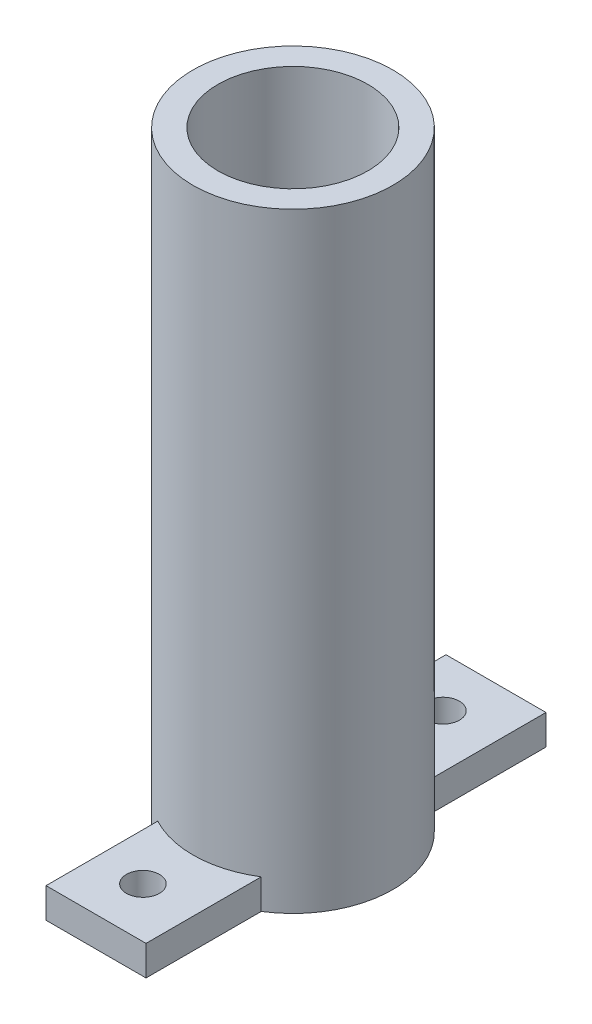
ISO-10303-21;
HEADER;
FILE_DESCRIPTION(('STEP AP214'),'2;1');
FILE_NAME('part.step','',(''),(''),'','','');
FILE_SCHEMA(('AUTOMOTIVE_DESIGN { 1 0 10303 214 1 1 1 1 }'));
ENDSEC;
DATA;
#1=APPLICATION_CONTEXT('core data for automotive mechanical design processes');
#2=APPLICATION_PROTOCOL_DEFINITION('international standard','automotive_design',2000,#1);
#3=PRODUCT_CONTEXT('',#1,'mechanical');
#4=PRODUCT('Part','Part','',(#3));
#5=PRODUCT_RELATED_PRODUCT_CATEGORY('part','',(#4));
#6=PRODUCT_DEFINITION_FORMATION('','',#4);
#7=PRODUCT_DEFINITION_CONTEXT('part definition',#1,'design');
#8=PRODUCT_DEFINITION('design','',#6,#7);
#9=PRODUCT_DEFINITION_SHAPE('','',#8);
#10=(LENGTH_UNIT() NAMED_UNIT(*) SI_UNIT(.MILLI.,.METRE.));
#11=(NAMED_UNIT(*) PLANE_ANGLE_UNIT() SI_UNIT($,.RADIAN.));
#12=(NAMED_UNIT(*) SI_UNIT($,.STERADIAN.) SOLID_ANGLE_UNIT());
#13=UNCERTAINTY_MEASURE_WITH_UNIT(LENGTH_MEASURE(1.E-05),#10,'distance_accuracy_value','');
#14=(GEOMETRIC_REPRESENTATION_CONTEXT(3) GLOBAL_UNCERTAINTY_ASSIGNED_CONTEXT((#13)) GLOBAL_UNIT_ASSIGNED_CONTEXT((#10,
#11,#12)) REPRESENTATION_CONTEXT('',''));
#15=CARTESIAN_POINT('',(0.,0.,0.));
#16=DIRECTION('',(0.,0.,1.));
#17=DIRECTION('',(1.,0.,0.));
#18=AXIS2_PLACEMENT_3D('',#15,#16,#17);
#19=CARTESIAN_POINT('',(0.,0.,0.));
#20=DIRECTION('',(0.,1.,0.));
#21=DIRECTION('',(0.,0.,1.));
#22=AXIS2_PLACEMENT_3D('',#19,#20,#21);
#23=PLANE('',#22);
#24=CARTESIAN_POINT('',(0.,0.,0.));
#25=DIRECTION('',(0.,1.,0.));
#26=DIRECTION('',(0.,0.,1.));
#27=AXIS2_PLACEMENT_3D('',#24,#25,#26);
#28=CIRCLE('',#27,10.);
#29=CARTESIAN_POINT('',(5.30717284691867,0.,-8.47548915242826));
#30=VERTEX_POINT('',#29);
#31=CARTESIAN_POINT('',(-4.69282715308133,0.,-8.83047978941703));
#32=VERTEX_POINT('',#31);
#33=EDGE_CURVE('E11',#30,#32,#28,.T.);
#34=ORIENTED_EDGE('',*,*,#33,.F.);
#35=DIRECTION('',(0.,0.,-1.));
#36=VECTOR('',#35,1.);
#37=CARTESIAN_POINT('',(5.30717284691867,0.,-20.));
#38=LINE('',#37,#36);
#39=CARTESIAN_POINT('',(5.30717284691867,0.,-20.));
#40=VERTEX_POINT('',#39);
#41=EDGE_CURVE('E144',#30,#40,#38,.T.);
#42=ORIENTED_EDGE('',*,*,#41,.T.);
#43=DIRECTION('',(-1.,0.,0.));
#44=VECTOR('',#43,1.);
#45=CARTESIAN_POINT('',(0.,0.,-20.));
#46=LINE('',#45,#44);
#47=CARTESIAN_POINT('',(-4.69282715308133,0.,-20.));
#48=VERTEX_POINT('',#47);
#49=EDGE_CURVE('E142',#40,#48,#46,.T.);
#50=ORIENTED_EDGE('',*,*,#49,.T.);
#51=DIRECTION('',(0.,0.,1.));
#52=VECTOR('',#51,1.);
#53=CARTESIAN_POINT('',(-4.69282715308133,0.,-20.));
#54=LINE('',#53,#52);
#55=EDGE_CURVE('E167',#48,#32,#54,.T.);
#56=ORIENTED_EDGE('',*,*,#55,.T.);
#57=EDGE_LOOP('',(#34,#42,#50,#56));
#58=FACE_BOUND('',#57,.T.);
#59=CARTESIAN_POINT('',(0.,0.,-15.));
#60=DIRECTION('',(0.,1.,0.));
#61=DIRECTION('',(0.,0.,1.));
#62=AXIS2_PLACEMENT_3D('',#59,#60,#61);
#63=CIRCLE('',#62,1.65);
#64=CARTESIAN_POINT('',(0.,0.,-13.35));
#65=VERTEX_POINT('',#64);
#66=EDGE_CURVE('E207',#65,#65,#63,.T.);
#67=ORIENTED_EDGE('',*,*,#66,.F.);
#68=EDGE_LOOP('',(#67));
#69=FACE_BOUND('',#68,.T.);
#70=ADVANCED_FACE('F32',(#58,#69),#23,.T.);
#71=CARTESIAN_POINT('',(0.,-3.,-20.));
#72=DIRECTION('',(0.,0.,-1.));
#73=DIRECTION('',(-1.,0.,0.));
#74=AXIS2_PLACEMENT_3D('',#71,#72,#73);
#75=PLANE('',#74);
#76=ORIENTED_EDGE('',*,*,#49,.F.);
#77=DIRECTION('',(0.,1.,0.));
#78=VECTOR('',#77,1.);
#79=CARTESIAN_POINT('',(5.30717284691867,-3.,-20.));
#80=LINE('',#79,#78);
#81=CARTESIAN_POINT('',(5.30717284691867,-3.,-20.));
#82=VERTEX_POINT('',#81);
#83=EDGE_CURVE('E84',#82,#40,#80,.T.);
#84=ORIENTED_EDGE('',*,*,#83,.F.);
#85=DIRECTION('',(-1.,0.,0.));
#86=VECTOR('',#85,1.);
#87=CARTESIAN_POINT('',(0.,-3.,-20.));
#88=LINE('',#87,#86);
#89=CARTESIAN_POINT('',(-4.69282715308133,-3.,-20.));
#90=VERTEX_POINT('',#89);
#91=EDGE_CURVE('E51',#82,#90,#88,.T.);
#92=ORIENTED_EDGE('',*,*,#91,.T.);
#93=DIRECTION('',(0.,1.,0.));
#94=VECTOR('',#93,1.);
#95=CARTESIAN_POINT('',(-4.69282715308133,-3.,-20.));
#96=LINE('',#95,#94);
#97=EDGE_CURVE('E92',#90,#48,#96,.T.);
#98=ORIENTED_EDGE('',*,*,#97,.T.);
#99=EDGE_LOOP('',(#76,#84,#92,#98));
#100=FACE_BOUND('',#99,.T.);
#101=ADVANCED_FACE('F233',(#100),#75,.T.);
#102=CARTESIAN_POINT('',(5.30717284691867,-3.,-20.));
#103=DIRECTION('',(1.,0.,0.));
#104=DIRECTION('',(0.,0.,-1.));
#105=AXIS2_PLACEMENT_3D('',#102,#103,#104);
#106=PLANE('',#105);
#107=ORIENTED_EDGE('',*,*,#41,.F.);
#108=DIRECTION('',(0.,1.,0.));
#109=VECTOR('',#108,1.);
#110=CARTESIAN_POINT('',(5.30717284691867,-3.,-8.47548915242826));
#111=LINE('',#110,#109);
#112=CARTESIAN_POINT('',(5.30717284691867,-3.,-8.47548915242826));
#113=VERTEX_POINT('',#112);
#114=EDGE_CURVE('E119',#113,#30,#111,.T.);
#115=ORIENTED_EDGE('',*,*,#114,.F.);
#116=DIRECTION('',(0.,0.,-1.));
#117=VECTOR('',#116,1.);
#118=CARTESIAN_POINT('',(5.30717284691867,-3.,-20.));
#119=LINE('',#118,#117);
#120=EDGE_CURVE('E126',#113,#82,#119,.T.);
#121=ORIENTED_EDGE('',*,*,#120,.T.);
#122=ORIENTED_EDGE('',*,*,#83,.T.);
#123=EDGE_LOOP('',(#107,#115,#121,#122));
#124=FACE_BOUND('',#123,.T.);
#125=ADVANCED_FACE('F238',(#124),#106,.T.);
#126=CARTESIAN_POINT('',(0.,-3.,0.));
#127=DIRECTION('',(0.,1.,0.));
#128=DIRECTION('',(0.,0.,1.));
#129=AXIS2_PLACEMENT_3D('',#126,#127,#128);
#130=CYLINDRICAL_SURFACE('',#129,10.);
#131=ORIENTED_EDGE('',*,*,#114,.T.);
#132=ORIENTED_EDGE('',*,*,#33,.T.);
#133=DIRECTION('',(0.,1.,0.));
#134=VECTOR('',#133,1.);
#135=CARTESIAN_POINT('',(-4.69282715308133,-3.,-8.83047978941703));
#136=LINE('',#135,#134);
#137=CARTESIAN_POINT('',(-4.69282715308133,-3.,-8.83047978941703));
#138=VERTEX_POINT('',#137);
#139=EDGE_CURVE('E152',#138,#32,#136,.T.);
#140=ORIENTED_EDGE('',*,*,#139,.F.);
#141=CARTESIAN_POINT('',(0.,-3.,0.));
#142=DIRECTION('',(0.,1.,0.));
#143=DIRECTION('',(0.,0.,1.));
#144=AXIS2_PLACEMENT_3D('',#141,#142,#143);
#145=CIRCLE('',#144,10.);
#146=CARTESIAN_POINT('',(-4.69282715308133,-3.,8.83047978941703));
#147=VERTEX_POINT('',#146);
#148=EDGE_CURVE('E195',#138,#147,#145,.T.);
#149=ORIENTED_EDGE('',*,*,#148,.T.);
#150=DIRECTION('',(0.,1.,0.));
#151=VECTOR('',#150,1.);
#152=CARTESIAN_POINT('',(-4.69282715308133,-3.,8.83047978941703));
#153=LINE('',#152,#151);
#154=CARTESIAN_POINT('',(-4.69282715308133,0.,8.83047978941703));
#155=VERTEX_POINT('',#154);
#156=EDGE_CURVE('E150',#147,#155,#153,.T.);
#157=ORIENTED_EDGE('',*,*,#156,.T.);
#158=CARTESIAN_POINT('',(5.30717284691867,0.,8.47548915242826));
#159=VERTEX_POINT('',#158);
#160=EDGE_CURVE('E42',#155,#159,#28,.T.);
#161=ORIENTED_EDGE('',*,*,#160,.T.);
#162=DIRECTION('',(0.,1.,0.));
#163=VECTOR('',#162,1.);
#164=CARTESIAN_POINT('',(5.30717284691867,-3.,8.47548915242826));
#165=LINE('',#164,#163);
#166=CARTESIAN_POINT('',(5.30717284691867,-3.,8.47548915242826));
#167=VERTEX_POINT('',#166);
#168=EDGE_CURVE('E110',#167,#159,#165,.T.);
#169=ORIENTED_EDGE('',*,*,#168,.F.);
#170=CARTESIAN_POINT('',(0.,-3.,0.));
#171=DIRECTION('',(0.,1.,0.));
#172=DIRECTION('',(0.,0.,1.));
#173=AXIS2_PLACEMENT_3D('',#170,#171,#172);
#174=CIRCLE('',#173,10.);
#175=EDGE_CURVE('E114',#167,#113,#174,.T.);
#176=ORIENTED_EDGE('',*,*,#175,.T.);
#177=EDGE_LOOP('',(#131,#132,#140,#149,#157,#161,#169,#176));
#178=FACE_BOUND('',#177,.T.);
#179=CARTESIAN_POINT('',(0.,58.,0.));
#180=DIRECTION('',(0.,1.,0.));
#181=DIRECTION('',(0.,0.,1.));
#182=AXIS2_PLACEMENT_3D('',#179,#180,#181);
#183=CIRCLE('',#182,10.);
#184=CARTESIAN_POINT('',(0.,58.,10.));
#185=VERTEX_POINT('',#184);
#186=EDGE_CURVE('E210',#185,#185,#183,.T.);
#187=ORIENTED_EDGE('',*,*,#186,.F.);
#188=EDGE_LOOP('',(#187));
#189=FACE_BOUND('',#188,.T.);
#190=ADVANCED_FACE('F112',(#178,#189),#130,.T.);
#191=CARTESIAN_POINT('',(5.30717284691867,-3.,20.));
#192=DIRECTION('',(1.,0.,0.));
#193=DIRECTION('',(0.,0.,-1.));
#194=AXIS2_PLACEMENT_3D('',#191,#192,#193);
#195=PLANE('',#194);
#196=DIRECTION('',(0.,0.,-1.));
#197=VECTOR('',#196,1.);
#198=CARTESIAN_POINT('',(5.30717284691867,0.,20.));
#199=LINE('',#198,#197);
#200=CARTESIAN_POINT('',(5.30717284691867,0.,20.));
#201=VERTEX_POINT('',#200);
#202=EDGE_CURVE('E140',#201,#159,#199,.T.);
#203=ORIENTED_EDGE('',*,*,#202,.F.);
#204=DIRECTION('',(0.,1.,0.));
#205=VECTOR('',#204,1.);
#206=CARTESIAN_POINT('',(5.30717284691867,-3.,20.));
#207=LINE('',#206,#205);
#208=CARTESIAN_POINT('',(5.30717284691867,-3.,20.));
#209=VERTEX_POINT('',#208);
#210=EDGE_CURVE('E120',#209,#201,#207,.T.);
#211=ORIENTED_EDGE('',*,*,#210,.F.);
#212=DIRECTION('',(0.,0.,-1.));
#213=VECTOR('',#212,1.);
#214=CARTESIAN_POINT('',(5.30717284691867,-3.,20.));
#215=LINE('',#214,#213);
#216=EDGE_CURVE('E125',#209,#167,#215,.T.);
#217=ORIENTED_EDGE('',*,*,#216,.T.);
#218=ORIENTED_EDGE('',*,*,#168,.T.);
#219=EDGE_LOOP('',(#203,#211,#217,#218));
#220=FACE_BOUND('',#219,.T.);
#221=ADVANCED_FACE('F129',(#220),#195,.T.);
#222=CARTESIAN_POINT('',(0.,-3.,20.));
#223=DIRECTION('',(0.,0.,1.));
#224=DIRECTION('',(1.,0.,0.));
#225=AXIS2_PLACEMENT_3D('',#222,#223,#224);
#226=PLANE('',#225);
#227=DIRECTION('',(1.,0.,0.));
#228=VECTOR('',#227,1.);
#229=CARTESIAN_POINT('',(0.,0.,20.));
#230=LINE('',#229,#228);
#231=CARTESIAN_POINT('',(-4.69282715308133,0.,20.));
#232=VERTEX_POINT('',#231);
#233=EDGE_CURVE('E137',#232,#201,#230,.T.);
#234=ORIENTED_EDGE('',*,*,#233,.F.);
#235=DIRECTION('',(0.,1.,0.));
#236=VECTOR('',#235,1.);
#237=CARTESIAN_POINT('',(-4.69282715308133,-3.,20.));
#238=LINE('',#237,#236);
#239=CARTESIAN_POINT('',(-4.69282715308133,-3.,20.));
#240=VERTEX_POINT('',#239);
#241=EDGE_CURVE('E147',#240,#232,#238,.T.);
#242=ORIENTED_EDGE('',*,*,#241,.F.);
#243=DIRECTION('',(1.,0.,0.));
#244=VECTOR('',#243,1.);
#245=CARTESIAN_POINT('',(0.,-3.,20.));
#246=LINE('',#245,#244);
#247=EDGE_CURVE('E130',#240,#209,#246,.T.);
#248=ORIENTED_EDGE('',*,*,#247,.T.);
#249=ORIENTED_EDGE('',*,*,#210,.T.);
#250=EDGE_LOOP('',(#234,#242,#248,#249));
#251=FACE_BOUND('',#250,.T.);
#252=ADVANCED_FACE('F188',(#251),#226,.T.);
#253=CARTESIAN_POINT('',(-4.69282715308133,-3.,20.));
#254=DIRECTION('',(-1.,0.,0.));
#255=DIRECTION('',(0.,0.,1.));
#256=AXIS2_PLACEMENT_3D('',#253,#254,#255);
#257=PLANE('',#256);
#258=DIRECTION('',(0.,0.,1.));
#259=VECTOR('',#258,1.);
#260=CARTESIAN_POINT('',(-4.69282715308133,0.,20.));
#261=LINE('',#260,#259);
#262=EDGE_CURVE('E141',#155,#232,#261,.T.);
#263=ORIENTED_EDGE('',*,*,#262,.F.);
#264=ORIENTED_EDGE('',*,*,#156,.F.);
#265=DIRECTION('',(0.,0.,1.));
#266=VECTOR('',#265,1.);
#267=CARTESIAN_POINT('',(-4.69282715308133,-3.,20.));
#268=LINE('',#267,#266);
#269=EDGE_CURVE('E132',#147,#240,#268,.T.);
#270=ORIENTED_EDGE('',*,*,#269,.T.);
#271=ORIENTED_EDGE('',*,*,#241,.T.);
#272=EDGE_LOOP('',(#263,#264,#270,#271));
#273=FACE_BOUND('',#272,.T.);
#274=ADVANCED_FACE('F191',(#273),#257,.T.);
#275=CARTESIAN_POINT('',(-4.69282715308133,-3.,-20.));
#276=DIRECTION('',(-1.,0.,0.));
#277=DIRECTION('',(0.,0.,1.));
#278=AXIS2_PLACEMENT_3D('',#275,#276,#277);
#279=PLANE('',#278);
#280=ORIENTED_EDGE('',*,*,#55,.F.);
#281=ORIENTED_EDGE('',*,*,#97,.F.);
#282=DIRECTION('',(0.,0.,1.));
#283=VECTOR('',#282,1.);
#284=CARTESIAN_POINT('',(-4.69282715308133,-3.,-20.));
#285=LINE('',#284,#283);
#286=EDGE_CURVE('E196',#90,#138,#285,.T.);
#287=ORIENTED_EDGE('',*,*,#286,.T.);
#288=ORIENTED_EDGE('',*,*,#139,.T.);
#289=EDGE_LOOP('',(#280,#281,#287,#288));
#290=FACE_BOUND('',#289,.T.);
#291=ADVANCED_FACE('F34',(#290),#279,.T.);
#292=CARTESIAN_POINT('',(0.,-3.,0.));
#293=DIRECTION('',(0.,1.,0.));
#294=DIRECTION('',(0.,0.,1.));
#295=AXIS2_PLACEMENT_3D('',#292,#293,#294);
#296=PLANE('',#295);
#297=CARTESIAN_POINT('',(0.,-3.,-15.));
#298=DIRECTION('',(0.,1.,0.));
#299=DIRECTION('',(0.,0.,1.));
#300=AXIS2_PLACEMENT_3D('',#297,#298,#299);
#301=CIRCLE('',#300,1.65);
#302=CARTESIAN_POINT('',(0.,-3.,-13.35));
#303=VERTEX_POINT('',#302);
#304=EDGE_CURVE('E204',#303,#303,#301,.T.);
#305=ORIENTED_EDGE('',*,*,#304,.T.);
#306=EDGE_LOOP('',(#305));
#307=FACE_BOUND('',#306,.T.);
#308=CARTESIAN_POINT('',(0.,-3.,15.));
#309=DIRECTION('',(0.,1.,0.));
#310=DIRECTION('',(0.,0.,1.));
#311=AXIS2_PLACEMENT_3D('',#308,#309,#310);
#312=CIRCLE('',#311,1.65);
#313=CARTESIAN_POINT('',(0.,-3.,16.65));
#314=VERTEX_POINT('',#313);
#315=EDGE_CURVE('E174',#314,#314,#312,.T.);
#316=ORIENTED_EDGE('',*,*,#315,.T.);
#317=EDGE_LOOP('',(#316));
#318=FACE_BOUND('',#317,.T.);
#319=CARTESIAN_POINT('',(0.,-3.,0.));
#320=DIRECTION('',(0.,1.,0.));
#321=DIRECTION('',(0.,0.,1.));
#322=AXIS2_PLACEMENT_3D('',#319,#320,#321);
#323=CIRCLE('',#322,7.5);
#324=CARTESIAN_POINT('',(0.,-3.,7.5));
#325=VERTEX_POINT('',#324);
#326=EDGE_CURVE('E171',#325,#325,#323,.T.);
#327=ORIENTED_EDGE('',*,*,#326,.T.);
#328=EDGE_LOOP('',(#327));
#329=FACE_BOUND('',#328,.T.);
#330=ORIENTED_EDGE('',*,*,#91,.F.);
#331=ORIENTED_EDGE('',*,*,#120,.F.);
#332=ORIENTED_EDGE('',*,*,#175,.F.);
#333=ORIENTED_EDGE('',*,*,#216,.F.);
#334=ORIENTED_EDGE('',*,*,#247,.F.);
#335=ORIENTED_EDGE('',*,*,#269,.F.);
#336=ORIENTED_EDGE('',*,*,#148,.F.);
#337=ORIENTED_EDGE('',*,*,#286,.F.);
#338=EDGE_LOOP('',(#330,#331,#332,#333,#334,#335,#336,#337));
#339=FACE_BOUND('',#338,.T.);
#340=ADVANCED_FACE('F123',(#307,#318,#329,#339),#296,.F.);
#341=ORIENTED_EDGE('',*,*,#160,.F.);
#342=ORIENTED_EDGE('',*,*,#262,.T.);
#343=ORIENTED_EDGE('',*,*,#233,.T.);
#344=ORIENTED_EDGE('',*,*,#202,.T.);
#345=EDGE_LOOP('',(#341,#342,#343,#344));
#346=FACE_BOUND('',#345,.T.);
#347=CARTESIAN_POINT('',(0.,0.,15.));
#348=DIRECTION('',(0.,1.,0.));
#349=DIRECTION('',(0.,0.,1.));
#350=AXIS2_PLACEMENT_3D('',#347,#348,#349);
#351=CIRCLE('',#350,1.65);
#352=CARTESIAN_POINT('',(0.,0.,16.65));
#353=VERTEX_POINT('',#352);
#354=EDGE_CURVE('E201',#353,#353,#351,.T.);
#355=ORIENTED_EDGE('',*,*,#354,.F.);
#356=EDGE_LOOP('',(#355));
#357=FACE_BOUND('',#356,.T.);
#358=ADVANCED_FACE('F185',(#346,#357),#23,.T.);
#359=CARTESIAN_POINT('',(0.,-3.,0.));
#360=DIRECTION('',(0.,1.,0.));
#361=DIRECTION('',(0.,0.,1.));
#362=AXIS2_PLACEMENT_3D('',#359,#360,#361);
#363=CYLINDRICAL_SURFACE('',#362,7.5);
#364=ORIENTED_EDGE('',*,*,#326,.F.);
#365=EDGE_LOOP('',(#364));
#366=FACE_BOUND('',#365,.T.);
#367=CARTESIAN_POINT('',(0.,58.,0.));
#368=DIRECTION('',(0.,1.,0.));
#369=DIRECTION('',(0.,0.,1.));
#370=AXIS2_PLACEMENT_3D('',#367,#368,#369);
#371=CIRCLE('',#370,7.5);
#372=CARTESIAN_POINT('',(0.,58.,7.5));
#373=VERTEX_POINT('',#372);
#374=EDGE_CURVE('E215',#373,#373,#371,.T.);
#375=ORIENTED_EDGE('',*,*,#374,.T.);
#376=EDGE_LOOP('',(#375));
#377=FACE_BOUND('',#376,.T.);
#378=ADVANCED_FACE('F219',(#366,#377),#363,.F.);
#379=CARTESIAN_POINT('',(0.,-3.,15.));
#380=DIRECTION('',(0.,1.,0.));
#381=DIRECTION('',(0.,0.,1.));
#382=AXIS2_PLACEMENT_3D('',#379,#380,#381);
#383=CYLINDRICAL_SURFACE('',#382,1.65);
#384=ORIENTED_EDGE('',*,*,#315,.F.);
#385=EDGE_LOOP('',(#384));
#386=FACE_BOUND('',#385,.T.);
#387=ORIENTED_EDGE('',*,*,#354,.T.);
#388=EDGE_LOOP('',(#387));
#389=FACE_BOUND('',#388,.T.);
#390=ADVANCED_FACE('F229',(#386,#389),#383,.F.);
#391=CARTESIAN_POINT('',(0.,-3.,-15.));
#392=DIRECTION('',(0.,1.,0.));
#393=DIRECTION('',(0.,0.,1.));
#394=AXIS2_PLACEMENT_3D('',#391,#392,#393);
#395=CYLINDRICAL_SURFACE('',#394,1.65);
#396=ORIENTED_EDGE('',*,*,#304,.F.);
#397=EDGE_LOOP('',(#396));
#398=FACE_BOUND('',#397,.T.);
#399=ORIENTED_EDGE('',*,*,#66,.T.);
#400=EDGE_LOOP('',(#399));
#401=FACE_BOUND('',#400,.T.);
#402=ADVANCED_FACE('F223',(#398,#401),#395,.F.);
#403=CARTESIAN_POINT('',(0.,58.,0.));
#404=DIRECTION('',(0.,1.,0.));
#405=DIRECTION('',(0.,0.,1.));
#406=AXIS2_PLACEMENT_3D('',#403,#404,#405);
#407=PLANE('',#406);
#408=ORIENTED_EDGE('',*,*,#186,.T.);
#409=EDGE_LOOP('',(#408));
#410=FACE_BOUND('',#409,.T.);
#411=ORIENTED_EDGE('',*,*,#374,.F.);
#412=EDGE_LOOP('',(#411));
#413=FACE_BOUND('',#412,.T.);
#414=ADVANCED_FACE('F221',(#410,#413),#407,.T.);
#415=CLOSED_SHELL('',(#70,#101,#125,#190,#221,#252,#274,#291,#340,#358,#378,#390,#402,#414));
#416=MANIFOLD_SOLID_BREP('B2',#415);
#417=ADVANCED_BREP_SHAPE_REPRESENTATION('',(#18,#416),#14);
#418=SHAPE_DEFINITION_REPRESENTATION(#9,#417);
ENDSEC;
END-ISO-10303-21;
